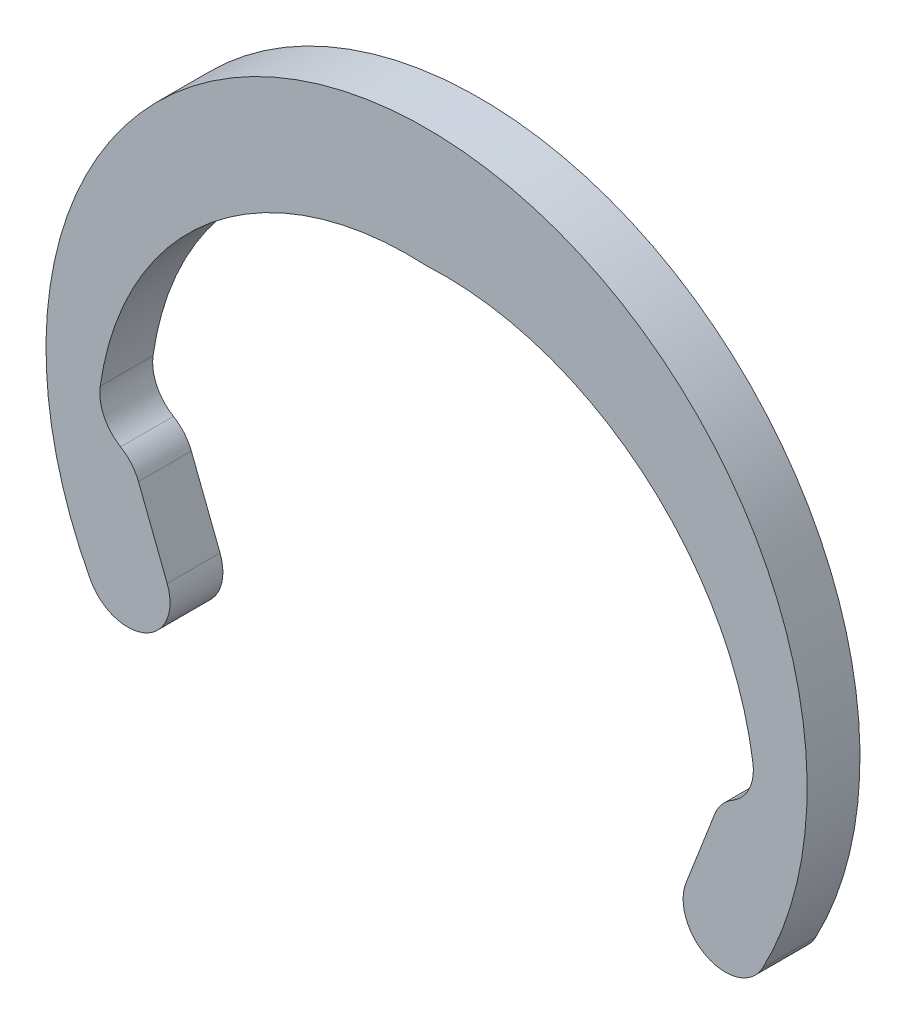
ISO-10303-21;
HEADER;
FILE_DESCRIPTION(('STEP AP214'),'2;1');
FILE_NAME('part.step','',(''),(''),'','','');
FILE_SCHEMA(('AUTOMOTIVE_DESIGN { 1 0 10303 214 1 1 1 1 }'));
ENDSEC;
DATA;
#1=APPLICATION_CONTEXT('core data for automotive mechanical design processes');
#2=APPLICATION_PROTOCOL_DEFINITION('international standard','automotive_design',2000,#1);
#3=PRODUCT_CONTEXT('',#1,'mechanical');
#4=PRODUCT('Part','Part','',(#3));
#5=PRODUCT_RELATED_PRODUCT_CATEGORY('part','',(#4));
#6=PRODUCT_DEFINITION_FORMATION('','',#4);
#7=PRODUCT_DEFINITION_CONTEXT('part definition',#1,'design');
#8=PRODUCT_DEFINITION('design','',#6,#7);
#9=PRODUCT_DEFINITION_SHAPE('','',#8);
#10=(LENGTH_UNIT() NAMED_UNIT(*) SI_UNIT(.MILLI.,.METRE.));
#11=(NAMED_UNIT(*) PLANE_ANGLE_UNIT() SI_UNIT($,.RADIAN.));
#12=(NAMED_UNIT(*) SI_UNIT($,.STERADIAN.) SOLID_ANGLE_UNIT());
#13=UNCERTAINTY_MEASURE_WITH_UNIT(LENGTH_MEASURE(1.E-05),#10,'distance_accuracy_value','');
#14=(GEOMETRIC_REPRESENTATION_CONTEXT(3) GLOBAL_UNCERTAINTY_ASSIGNED_CONTEXT((#13)) GLOBAL_UNIT_ASSIGNED_CONTEXT((#10,
#11,#12)) REPRESENTATION_CONTEXT('',''));
#15=CARTESIAN_POINT('',(0.,0.,0.));
#16=DIRECTION('',(0.,0.,1.));
#17=DIRECTION('',(1.,0.,0.));
#18=AXIS2_PLACEMENT_3D('',#15,#16,#17);
#19=CARTESIAN_POINT('',(-0.33323163933398,-0.942844989670512,1.));
#20=DIRECTION('',(0.,0.,-1.));
#21=DIRECTION('',(-1.,0.,0.));
#22=AXIS2_PLACEMENT_3D('',#19,#20,#21);
#23=CYLINDRICAL_SURFACE('',#22,5.9);
#24=CARTESIAN_POINT('',(-0.33323163933398,-0.942844989670512,0.));
#25=DIRECTION('',(0.,0.,-1.));
#26=DIRECTION('',(-1.,0.,0.));
#27=AXIS2_PLACEMENT_3D('',#24,#25,#26);
#28=CIRCLE('',#27,5.9);
#29=CARTESIAN_POINT('',(-6.17437242672128,-0.111536201120468,0.));
#30=VERTEX_POINT('',#29);
#31=CARTESIAN_POINT('',(0.,4.9477370422298,0.));
#32=VERTEX_POINT('',#31);
#33=EDGE_CURVE('E121',#30,#32,#28,.T.);
#34=ORIENTED_EDGE('',*,*,#33,.T.);
#35=DIRECTION('',(0.,0.,-1.));
#36=VECTOR('',#35,1.);
#37=CARTESIAN_POINT('',(0.,4.9477370422298,1.));
#38=LINE('',#37,#36);
#39=CARTESIAN_POINT('',(0.,4.9477370422298,1.));
#40=VERTEX_POINT('',#39);
#41=EDGE_CURVE('E11',#40,#32,#38,.T.);
#42=ORIENTED_EDGE('',*,*,#41,.F.);
#43=CARTESIAN_POINT('',(-0.33323163933398,-0.942844989670512,1.));
#44=DIRECTION('',(0.,0.,-1.));
#45=DIRECTION('',(-1.,0.,0.));
#46=AXIS2_PLACEMENT_3D('',#43,#44,#45);
#47=CIRCLE('',#46,5.9);
#48=CARTESIAN_POINT('',(-6.17437242672128,-0.111536201120468,1.));
#49=VERTEX_POINT('',#48);
#50=EDGE_CURVE('E154',#49,#40,#47,.T.);
#51=ORIENTED_EDGE('',*,*,#50,.F.);
#52=DIRECTION('',(0.,0.,-1.));
#53=VECTOR('',#52,1.);
#54=CARTESIAN_POINT('',(-6.17437242672128,-0.111536201120468,1.));
#55=LINE('',#54,#53);
#56=EDGE_CURVE('E134',#49,#30,#55,.T.);
#57=ORIENTED_EDGE('',*,*,#56,.T.);
#58=EDGE_LOOP('',(#34,#42,#51,#57));
#59=FACE_BOUND('',#58,.T.);
#60=ADVANCED_FACE('F35',(#59),#23,.F.);
#61=CARTESIAN_POINT('',(0.33323163933398,-0.942844989670512,1.));
#62=DIRECTION('',(0.,0.,-1.));
#63=DIRECTION('',(-1.,0.,0.));
#64=AXIS2_PLACEMENT_3D('',#61,#62,#63);
#65=CYLINDRICAL_SURFACE('',#64,5.9);
#66=CARTESIAN_POINT('',(0.33323163933398,-0.942844989670512,0.));
#67=DIRECTION('',(0.,0.,-1.));
#68=DIRECTION('',(1.,0.,0.));
#69=AXIS2_PLACEMENT_3D('',#66,#67,#68);
#70=CIRCLE('',#69,5.9);
#71=CARTESIAN_POINT('',(6.17437242672128,-0.111536201120468,0.));
#72=VERTEX_POINT('',#71);
#73=EDGE_CURVE('E117',#32,#72,#70,.T.);
#74=ORIENTED_EDGE('',*,*,#73,.T.);
#75=DIRECTION('',(0.,0.,-1.));
#76=VECTOR('',#75,1.);
#77=CARTESIAN_POINT('',(6.17437242672128,-0.111536201120468,1.));
#78=LINE('',#77,#76);
#79=CARTESIAN_POINT('',(6.17437242672128,-0.111536201120468,1.));
#80=VERTEX_POINT('',#79);
#81=EDGE_CURVE('E42',#80,#72,#78,.T.);
#82=ORIENTED_EDGE('',*,*,#81,.F.);
#83=CARTESIAN_POINT('',(0.33323163933398,-0.942844989670512,1.));
#84=DIRECTION('',(0.,0.,-1.));
#85=DIRECTION('',(1.,0.,0.));
#86=AXIS2_PLACEMENT_3D('',#83,#84,#85);
#87=CIRCLE('',#86,5.9);
#88=EDGE_CURVE('E130',#40,#80,#87,.T.);
#89=ORIENTED_EDGE('',*,*,#88,.F.);
#90=ORIENTED_EDGE('',*,*,#41,.T.);
#91=EDGE_LOOP('',(#74,#82,#89,#90));
#92=FACE_BOUND('',#91,.T.);
#93=ADVANCED_FACE('F129',(#92),#65,.F.);
#94=CARTESIAN_POINT('',(5.38235333690605,-0.224256036856067,1.));
#95=DIRECTION('',(0.,0.,-1.));
#96=DIRECTION('',(-1.,0.,0.));
#97=AXIS2_PLACEMENT_3D('',#94,#95,#96);
#98=CYLINDRICAL_SURFACE('',#97,0.8);
#99=CARTESIAN_POINT('',(5.38235333690605,-0.224256036856067,0.));
#100=DIRECTION('',(0.,0.,-1.));
#101=DIRECTION('',(-1.,0.,0.));
#102=AXIS2_PLACEMENT_3D('',#99,#100,#101);
#103=CIRCLE('',#102,0.8);
#104=CARTESIAN_POINT('',(5.78933913736544,-0.912995870337793,0.));
#105=VERTEX_POINT('',#104);
#106=EDGE_CURVE('E123',#72,#105,#103,.T.);
#107=ORIENTED_EDGE('',*,*,#106,.T.);
#108=DIRECTION('',(0.,0.,-1.));
#109=VECTOR('',#108,1.);
#110=CARTESIAN_POINT('',(5.78933913736544,-0.912995870337793,1.));
#111=LINE('',#110,#109);
#112=CARTESIAN_POINT('',(5.78933913736544,-0.912995870337793,1.));
#113=VERTEX_POINT('',#112);
#114=EDGE_CURVE('E195',#113,#105,#111,.T.);
#115=ORIENTED_EDGE('',*,*,#114,.F.);
#116=CARTESIAN_POINT('',(5.38235333690605,-0.224256036856067,1.));
#117=DIRECTION('',(0.,0.,-1.));
#118=DIRECTION('',(-1.,0.,0.));
#119=AXIS2_PLACEMENT_3D('',#116,#117,#118);
#120=CIRCLE('',#119,0.8);
#121=EDGE_CURVE('E157',#80,#113,#120,.T.);
#122=ORIENTED_EDGE('',*,*,#121,.F.);
#123=ORIENTED_EDGE('',*,*,#81,.T.);
#124=EDGE_LOOP('',(#107,#115,#122,#123));
#125=FACE_BOUND('',#124,.T.);
#126=ADVANCED_FACE('F199',(#125),#98,.F.);
#127=CARTESIAN_POINT('',(6.19632493782482,-1.60173570381952,1.));
#128=DIRECTION('',(0.,0.,-1.));
#129=DIRECTION('',(-1.,0.,0.));
#130=AXIS2_PLACEMENT_3D('',#127,#128,#129);
#131=CYLINDRICAL_SURFACE('',#130,0.799999999999999);
#132=CARTESIAN_POINT('',(6.19632493782482,-1.60173570381952,0.));
#133=DIRECTION('',(0.,0.,1.));
#134=DIRECTION('',(1.,0.,0.));
#135=AXIS2_PLACEMENT_3D('',#132,#133,#134);
#136=CIRCLE('',#135,0.799999999999999);
#137=CARTESIAN_POINT('',(5.4505839798619,-1.31213179566816,0.));
#138=VERTEX_POINT('',#137);
#139=EDGE_CURVE('E138',#105,#138,#136,.T.);
#140=ORIENTED_EDGE('',*,*,#139,.T.);
#141=DIRECTION('',(0.,0.,-1.));
#142=VECTOR('',#141,1.);
#143=CARTESIAN_POINT('',(5.4505839798619,-1.31213179566816,1.));
#144=LINE('',#143,#142);
#145=CARTESIAN_POINT('',(5.4505839798619,-1.31213179566816,1.));
#146=VERTEX_POINT('',#145);
#147=EDGE_CURVE('E192',#146,#138,#144,.T.);
#148=ORIENTED_EDGE('',*,*,#147,.F.);
#149=CARTESIAN_POINT('',(6.19632493782482,-1.60173570381952,1.));
#150=DIRECTION('',(0.,0.,1.));
#151=DIRECTION('',(1.,0.,0.));
#152=AXIS2_PLACEMENT_3D('',#149,#150,#151);
#153=CIRCLE('',#152,0.799999999999999);
#154=EDGE_CURVE('E159',#113,#146,#153,.T.);
#155=ORIENTED_EDGE('',*,*,#154,.F.);
#156=ORIENTED_EDGE('',*,*,#114,.T.);
#157=EDGE_LOOP('',(#140,#148,#155,#156));
#158=FACE_BOUND('',#157,.T.);
#159=ADVANCED_FACE('F207',(#158),#131,.T.);
#160=CARTESIAN_POINT('',(5.4505839798619,-1.31213179566816,1.));
#161=DIRECTION('',(0.932176197453655,-0.362004885189197,0.));
#162=DIRECTION('',(0.362004885189197,0.932176197453656,0.));
#163=AXIS2_PLACEMENT_3D('',#160,#161,#162);
#164=PLANE('',#163);
#165=DIRECTION('',(-0.362004885189197,-0.932176197453656,0.));
#166=VECTOR('',#165,1.);
#167=CARTESIAN_POINT('',(5.4505839798619,-1.31213179566816,0.));
#168=LINE('',#167,#166);
#169=CARTESIAN_POINT('',(4.9075766520781,-2.71039609184864,0.));
#170=VERTEX_POINT('',#169);
#171=EDGE_CURVE('E140',#138,#170,#168,.T.);
#172=ORIENTED_EDGE('',*,*,#171,.T.);
#173=DIRECTION('',(0.,0.,-1.));
#174=VECTOR('',#173,1.);
#175=CARTESIAN_POINT('',(4.9075766520781,-2.71039609184864,1.));
#176=LINE('',#175,#174);
#177=CARTESIAN_POINT('',(4.9075766520781,-2.71039609184864,1.));
#178=VERTEX_POINT('',#177);
#179=EDGE_CURVE('E189',#178,#170,#176,.T.);
#180=ORIENTED_EDGE('',*,*,#179,.F.);
#181=DIRECTION('',(-0.362004885189197,-0.932176197453656,0.));
#182=VECTOR('',#181,1.);
#183=CARTESIAN_POINT('',(5.4505839798619,-1.31213179566816,1.));
#184=LINE('',#183,#182);
#185=EDGE_CURVE('E161',#146,#178,#184,.T.);
#186=ORIENTED_EDGE('',*,*,#185,.F.);
#187=ORIENTED_EDGE('',*,*,#147,.T.);
#188=EDGE_LOOP('',(#172,#180,#186,#187));
#189=FACE_BOUND('',#188,.T.);
#190=ADVANCED_FACE('F210',(#189),#164,.F.);
#191=CARTESIAN_POINT('',(5.65331761004103,-3.,1.));
#192=DIRECTION('',(0.,0.,-1.));
#193=DIRECTION('',(-1.,0.,0.));
#194=AXIS2_PLACEMENT_3D('',#191,#192,#193);
#195=CYLINDRICAL_SURFACE('',#194,0.799999999999998);
#196=CARTESIAN_POINT('',(5.65331761004103,-3.,0.));
#197=DIRECTION('',(0.,0.,1.));
#198=DIRECTION('',(1.,0.,0.));
#199=AXIS2_PLACEMENT_3D('',#196,#197,#198);
#200=CIRCLE('',#199,0.799999999999998);
#201=CARTESIAN_POINT('',(6.35998231129615,-3.375,0.));
#202=VERTEX_POINT('',#201);
#203=EDGE_CURVE('E142',#170,#202,#200,.T.);
#204=ORIENTED_EDGE('',*,*,#203,.T.);
#205=DIRECTION('',(0.,0.,-1.));
#206=VECTOR('',#205,1.);
#207=CARTESIAN_POINT('',(6.35998231129615,-3.375,1.));
#208=LINE('',#207,#206);
#209=CARTESIAN_POINT('',(6.35998231129615,-3.375,1.));
#210=VERTEX_POINT('',#209);
#211=EDGE_CURVE('E186',#210,#202,#208,.T.);
#212=ORIENTED_EDGE('',*,*,#211,.F.);
#213=CARTESIAN_POINT('',(5.65331761004103,-3.,1.));
#214=DIRECTION('',(0.,0.,1.));
#215=DIRECTION('',(1.,0.,0.));
#216=AXIS2_PLACEMENT_3D('',#213,#214,#215);
#217=CIRCLE('',#216,0.799999999999998);
#218=EDGE_CURVE('E163',#178,#210,#217,.T.);
#219=ORIENTED_EDGE('',*,*,#218,.F.);
#220=ORIENTED_EDGE('',*,*,#179,.T.);
#221=EDGE_LOOP('',(#204,#212,#219,#220));
#222=FACE_BOUND('',#221,.T.);
#223=ADVANCED_FACE('F215',(#222),#195,.T.);
#224=CARTESIAN_POINT('',(0.,0.,1.));
#225=DIRECTION('',(0.,0.,-1.));
#226=DIRECTION('',(-1.,0.,0.));
#227=AXIS2_PLACEMENT_3D('',#224,#225,#226);
#228=CYLINDRICAL_SURFACE('',#227,7.2);
#229=CARTESIAN_POINT('',(0.,0.,0.));
#230=DIRECTION('',(0.,0.,1.));
#231=DIRECTION('',(1.,0.,0.));
#232=AXIS2_PLACEMENT_3D('',#229,#230,#231);
#233=CIRCLE('',#232,7.2);
#234=CARTESIAN_POINT('',(-6.35998231129615,-3.375,0.));
#235=VERTEX_POINT('',#234);
#236=EDGE_CURVE('E144',#202,#235,#233,.T.);
#237=ORIENTED_EDGE('',*,*,#236,.T.);
#238=DIRECTION('',(0.,0.,-1.));
#239=VECTOR('',#238,1.);
#240=CARTESIAN_POINT('',(-6.35998231129615,-3.375,1.));
#241=LINE('',#240,#239);
#242=CARTESIAN_POINT('',(-6.35998231129615,-3.375,1.));
#243=VERTEX_POINT('',#242);
#244=EDGE_CURVE('E183',#243,#235,#241,.T.);
#245=ORIENTED_EDGE('',*,*,#244,.F.);
#246=CARTESIAN_POINT('',(0.,0.,1.));
#247=DIRECTION('',(0.,0.,1.));
#248=DIRECTION('',(1.,0.,0.));
#249=AXIS2_PLACEMENT_3D('',#246,#247,#248);
#250=CIRCLE('',#249,7.2);
#251=EDGE_CURVE('E165',#210,#243,#250,.T.);
#252=ORIENTED_EDGE('',*,*,#251,.F.);
#253=ORIENTED_EDGE('',*,*,#211,.T.);
#254=EDGE_LOOP('',(#237,#245,#252,#253));
#255=FACE_BOUND('',#254,.T.);
#256=ADVANCED_FACE('F221',(#255),#228,.T.);
#257=CARTESIAN_POINT('',(-5.65331761004103,-3.,1.));
#258=DIRECTION('',(0.,0.,-1.));
#259=DIRECTION('',(-1.,0.,0.));
#260=AXIS2_PLACEMENT_3D('',#257,#258,#259);
#261=CYLINDRICAL_SURFACE('',#260,0.799999999999998);
#262=CARTESIAN_POINT('',(-5.65331761004103,-3.,0.));
#263=DIRECTION('',(0.,0.,1.));
#264=DIRECTION('',(-1.,0.,0.));
#265=AXIS2_PLACEMENT_3D('',#262,#263,#264);
#266=CIRCLE('',#265,0.799999999999998);
#267=CARTESIAN_POINT('',(-4.9075766520781,-2.71039609184864,0.));
#268=VERTEX_POINT('',#267);
#269=EDGE_CURVE('E146',#235,#268,#266,.T.);
#270=ORIENTED_EDGE('',*,*,#269,.T.);
#271=DIRECTION('',(0.,0.,-1.));
#272=VECTOR('',#271,1.);
#273=CARTESIAN_POINT('',(-4.9075766520781,-2.71039609184864,1.));
#274=LINE('',#273,#272);
#275=CARTESIAN_POINT('',(-4.9075766520781,-2.71039609184864,1.));
#276=VERTEX_POINT('',#275);
#277=EDGE_CURVE('E180',#276,#268,#274,.T.);
#278=ORIENTED_EDGE('',*,*,#277,.F.);
#279=CARTESIAN_POINT('',(-5.65331761004103,-3.,1.));
#280=DIRECTION('',(0.,0.,1.));
#281=DIRECTION('',(-1.,0.,0.));
#282=AXIS2_PLACEMENT_3D('',#279,#280,#281);
#283=CIRCLE('',#282,0.799999999999998);
#284=EDGE_CURVE('E167',#243,#276,#283,.T.);
#285=ORIENTED_EDGE('',*,*,#284,.F.);
#286=ORIENTED_EDGE('',*,*,#244,.T.);
#287=EDGE_LOOP('',(#270,#278,#285,#286));
#288=FACE_BOUND('',#287,.T.);
#289=ADVANCED_FACE('F225',(#288),#261,.T.);
#290=CARTESIAN_POINT('',(-5.4505839798619,-1.31213179566816,1.));
#291=DIRECTION('',(-0.932176197453655,-0.362004885189197,0.));
#292=DIRECTION('',(0.362004885189197,-0.932176197453656,0.));
#293=AXIS2_PLACEMENT_3D('',#290,#291,#292);
#294=PLANE('',#293);
#295=DIRECTION('',(-0.362004885189197,0.932176197453656,0.));
#296=VECTOR('',#295,1.);
#297=CARTESIAN_POINT('',(-5.4505839798619,-1.31213179566816,0.));
#298=LINE('',#297,#296);
#299=CARTESIAN_POINT('',(-5.4505839798619,-1.31213179566816,0.));
#300=VERTEX_POINT('',#299);
#301=EDGE_CURVE('E148',#268,#300,#298,.T.);
#302=ORIENTED_EDGE('',*,*,#301,.T.);
#303=DIRECTION('',(0.,0.,-1.));
#304=VECTOR('',#303,1.);
#305=CARTESIAN_POINT('',(-5.4505839798619,-1.31213179566816,1.));
#306=LINE('',#305,#304);
#307=CARTESIAN_POINT('',(-5.4505839798619,-1.31213179566816,1.));
#308=VERTEX_POINT('',#307);
#309=EDGE_CURVE('E177',#308,#300,#306,.T.);
#310=ORIENTED_EDGE('',*,*,#309,.F.);
#311=DIRECTION('',(-0.362004885189197,0.932176197453656,0.));
#312=VECTOR('',#311,1.);
#313=CARTESIAN_POINT('',(-5.4505839798619,-1.31213179566816,1.));
#314=LINE('',#313,#312);
#315=EDGE_CURVE('E169',#276,#308,#314,.T.);
#316=ORIENTED_EDGE('',*,*,#315,.F.);
#317=ORIENTED_EDGE('',*,*,#277,.T.);
#318=EDGE_LOOP('',(#302,#310,#316,#317));
#319=FACE_BOUND('',#318,.T.);
#320=ADVANCED_FACE('F230',(#319),#294,.F.);
#321=CARTESIAN_POINT('',(-6.19632493782482,-1.60173570381952,1.));
#322=DIRECTION('',(0.,0.,-1.));
#323=DIRECTION('',(-1.,0.,0.));
#324=AXIS2_PLACEMENT_3D('',#321,#322,#323);
#325=CYLINDRICAL_SURFACE('',#324,0.799999999999999);
#326=CARTESIAN_POINT('',(-6.19632493782482,-1.60173570381952,0.));
#327=DIRECTION('',(0.,0.,1.));
#328=DIRECTION('',(-1.,0.,0.));
#329=AXIS2_PLACEMENT_3D('',#326,#327,#328);
#330=CIRCLE('',#329,0.799999999999999);
#331=CARTESIAN_POINT('',(-5.78933913736544,-0.912995870337793,0.));
#332=VERTEX_POINT('',#331);
#333=EDGE_CURVE('E150',#300,#332,#330,.T.);
#334=ORIENTED_EDGE('',*,*,#333,.T.);
#335=DIRECTION('',(0.,0.,-1.));
#336=VECTOR('',#335,1.);
#337=CARTESIAN_POINT('',(-5.78933913736544,-0.912995870337793,1.));
#338=LINE('',#337,#336);
#339=CARTESIAN_POINT('',(-5.78933913736544,-0.912995870337793,1.));
#340=VERTEX_POINT('',#339);
#341=EDGE_CURVE('E174',#340,#332,#338,.T.);
#342=ORIENTED_EDGE('',*,*,#341,.F.);
#343=CARTESIAN_POINT('',(-6.19632493782482,-1.60173570381952,1.));
#344=DIRECTION('',(0.,0.,1.));
#345=DIRECTION('',(-1.,0.,0.));
#346=AXIS2_PLACEMENT_3D('',#343,#344,#345);
#347=CIRCLE('',#346,0.799999999999999);
#348=EDGE_CURVE('E54',#308,#340,#347,.T.);
#349=ORIENTED_EDGE('',*,*,#348,.F.);
#350=ORIENTED_EDGE('',*,*,#309,.T.);
#351=EDGE_LOOP('',(#334,#342,#349,#350));
#352=FACE_BOUND('',#351,.T.);
#353=ADVANCED_FACE('F233',(#352),#325,.T.);
#354=CARTESIAN_POINT('',(-5.38235333690605,-0.224256036856067,1.));
#355=DIRECTION('',(0.,0.,-1.));
#356=DIRECTION('',(-1.,0.,0.));
#357=AXIS2_PLACEMENT_3D('',#354,#355,#356);
#358=CYLINDRICAL_SURFACE('',#357,0.8);
#359=CARTESIAN_POINT('',(-5.38235333690605,-0.224256036856067,0.));
#360=DIRECTION('',(0.,0.,-1.));
#361=DIRECTION('',(1.,0.,0.));
#362=AXIS2_PLACEMENT_3D('',#359,#360,#361);
#363=CIRCLE('',#362,0.8);
#364=EDGE_CURVE('E152',#332,#30,#363,.T.);
#365=ORIENTED_EDGE('',*,*,#364,.T.);
#366=ORIENTED_EDGE('',*,*,#56,.F.);
#367=CARTESIAN_POINT('',(-5.38235333690605,-0.224256036856067,1.));
#368=DIRECTION('',(0.,0.,-1.));
#369=DIRECTION('',(1.,0.,0.));
#370=AXIS2_PLACEMENT_3D('',#367,#368,#369);
#371=CIRCLE('',#370,0.8);
#372=EDGE_CURVE('E49',#340,#49,#371,.T.);
#373=ORIENTED_EDGE('',*,*,#372,.F.);
#374=ORIENTED_EDGE('',*,*,#341,.T.);
#375=EDGE_LOOP('',(#365,#366,#373,#374));
#376=FACE_BOUND('',#375,.T.);
#377=ADVANCED_FACE('F235',(#376),#358,.F.);
#378=CARTESIAN_POINT('',(-0.33323163933398,-0.942844989670512,1.));
#379=DIRECTION('',(0.,0.,-1.));
#380=DIRECTION('',(-1.,0.,0.));
#381=AXIS2_PLACEMENT_3D('',#378,#379,#380);
#382=PLANE('',#381);
#383=ORIENTED_EDGE('',*,*,#50,.T.);
#384=ORIENTED_EDGE('',*,*,#88,.T.);
#385=ORIENTED_EDGE('',*,*,#121,.T.);
#386=ORIENTED_EDGE('',*,*,#154,.T.);
#387=ORIENTED_EDGE('',*,*,#185,.T.);
#388=ORIENTED_EDGE('',*,*,#218,.T.);
#389=ORIENTED_EDGE('',*,*,#251,.T.);
#390=ORIENTED_EDGE('',*,*,#284,.T.);
#391=ORIENTED_EDGE('',*,*,#315,.T.);
#392=ORIENTED_EDGE('',*,*,#348,.T.);
#393=ORIENTED_EDGE('',*,*,#372,.T.);
#394=EDGE_LOOP('',(#383,#384,#385,#386,#387,#388,#389,#390,#391,#392,#393));
#395=FACE_BOUND('',#394,.T.);
#396=ADVANCED_FACE('F202',(#395),#382,.F.);
#397=CARTESIAN_POINT('',(-0.33323163933398,-0.942844989670512,0.));
#398=DIRECTION('',(0.,0.,-1.));
#399=DIRECTION('',(-1.,0.,0.));
#400=AXIS2_PLACEMENT_3D('',#397,#398,#399);
#401=PLANE('',#400);
#402=ORIENTED_EDGE('',*,*,#33,.F.);
#403=ORIENTED_EDGE('',*,*,#364,.F.);
#404=ORIENTED_EDGE('',*,*,#333,.F.);
#405=ORIENTED_EDGE('',*,*,#301,.F.);
#406=ORIENTED_EDGE('',*,*,#269,.F.);
#407=ORIENTED_EDGE('',*,*,#236,.F.);
#408=ORIENTED_EDGE('',*,*,#203,.F.);
#409=ORIENTED_EDGE('',*,*,#171,.F.);
#410=ORIENTED_EDGE('',*,*,#139,.F.);
#411=ORIENTED_EDGE('',*,*,#106,.F.);
#412=ORIENTED_EDGE('',*,*,#73,.F.);
#413=EDGE_LOOP('',(#402,#403,#404,#405,#406,#407,#408,#409,#410,#411,#412));
#414=FACE_BOUND('',#413,.T.);
#415=ADVANCED_FACE('F118',(#414),#401,.T.);
#416=CLOSED_SHELL('',(#60,#93,#126,#159,#190,#223,#256,#289,#320,#353,#377,#396,#415));
#417=MANIFOLD_SOLID_BREP('B2',#416);
#418=ADVANCED_BREP_SHAPE_REPRESENTATION('',(#18,#417),#14);
#419=SHAPE_DEFINITION_REPRESENTATION(#9,#418);
ENDSEC;
END-ISO-10303-21;
